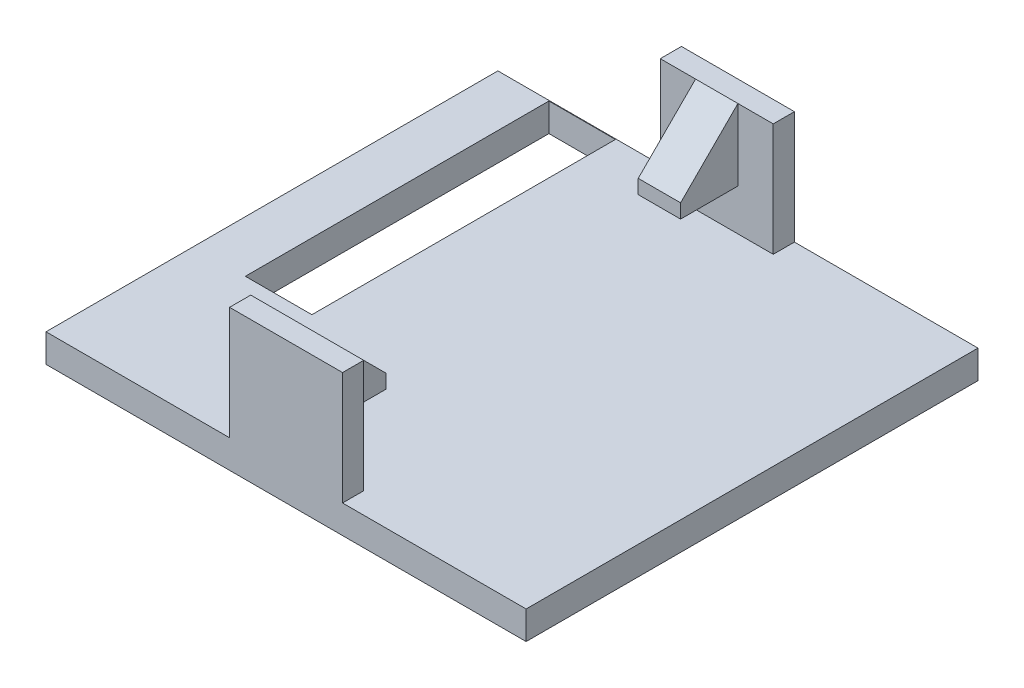
ISO-10303-21;
HEADER;
FILE_DESCRIPTION(('STEP AP214'),'2;1');
FILE_NAME('part.step','',(''),(''),'','','');
FILE_SCHEMA(('AUTOMOTIVE_DESIGN { 1 0 10303 214 1 1 1 1 }'));
ENDSEC;
DATA;
#1=APPLICATION_CONTEXT('core data for automotive mechanical design processes');
#2=APPLICATION_PROTOCOL_DEFINITION('international standard','automotive_design',2000,#1);
#3=PRODUCT_CONTEXT('',#1,'mechanical');
#4=PRODUCT('Part','Part','',(#3));
#5=PRODUCT_RELATED_PRODUCT_CATEGORY('part','',(#4));
#6=PRODUCT_DEFINITION_FORMATION('','',#4);
#7=PRODUCT_DEFINITION_CONTEXT('part definition',#1,'design');
#8=PRODUCT_DEFINITION('design','',#6,#7);
#9=PRODUCT_DEFINITION_SHAPE('','',#8);
#10=(LENGTH_UNIT() NAMED_UNIT(*) SI_UNIT(.MILLI.,.METRE.));
#11=(NAMED_UNIT(*) PLANE_ANGLE_UNIT() SI_UNIT($,.RADIAN.));
#12=(NAMED_UNIT(*) SI_UNIT($,.STERADIAN.) SOLID_ANGLE_UNIT());
#13=UNCERTAINTY_MEASURE_WITH_UNIT(LENGTH_MEASURE(1.E-05),#10,'distance_accuracy_value','');
#14=(GEOMETRIC_REPRESENTATION_CONTEXT(3) GLOBAL_UNCERTAINTY_ASSIGNED_CONTEXT((#13)) GLOBAL_UNIT_ASSIGNED_CONTEXT((#10,
#11,#12)) REPRESENTATION_CONTEXT('',''));
#15=CARTESIAN_POINT('',(0.,0.,0.));
#16=DIRECTION('',(0.,0.,1.));
#17=DIRECTION('',(1.,0.,0.));
#18=AXIS2_PLACEMENT_3D('',#15,#16,#17);
#19=CARTESIAN_POINT('',(0.,2.,0.));
#20=DIRECTION('',(0.,-1.,0.));
#21=DIRECTION('',(0.,0.,-1.));
#22=AXIS2_PLACEMENT_3D('',#19,#20,#21);
#23=PLANE('',#22);
#24=DIRECTION('',(1.,0.,0.));
#25=VECTOR('',#24,1.);
#26=CARTESIAN_POINT('',(-13.3450789031749,2.,5.5379262030686));
#27=LINE('',#26,#25);
#28=CARTESIAN_POINT('',(-13.3450789031749,2.,5.5379262030686));
#29=VERTEX_POINT('',#28);
#30=CARTESIAN_POINT('',(-8.63207002471189,2.,5.5379262030686));
#31=VERTEX_POINT('',#30);
#32=EDGE_CURVE('E216',#29,#31,#27,.T.);
#33=ORIENTED_EDGE('',*,*,#32,.F.);
#34=DIRECTION('',(0.,0.,1.));
#35=VECTOR('',#34,1.);
#36=CARTESIAN_POINT('',(-13.3450789031749,2.,-15.9601840970242));
#37=LINE('',#36,#35);
#38=CARTESIAN_POINT('',(-13.3450789031749,2.,-15.9601840970242));
#39=VERTEX_POINT('',#38);
#40=EDGE_CURVE('E62',#39,#29,#37,.T.);
#41=ORIENTED_EDGE('',*,*,#40,.F.);
#42=DIRECTION('',(-1.,0.,0.));
#43=VECTOR('',#42,1.);
#44=CARTESIAN_POINT('',(-13.3450789031749,2.,-15.9601840970242));
#45=LINE('',#44,#43);
#46=CARTESIAN_POINT('',(-8.63207002471189,2.,-15.9601840970242));
#47=VERTEX_POINT('',#46);
#48=EDGE_CURVE('E228',#47,#39,#45,.T.);
#49=ORIENTED_EDGE('',*,*,#48,.F.);
#50=DIRECTION('',(0.,0.,-1.));
#51=VECTOR('',#50,1.);
#52=CARTESIAN_POINT('',(-8.63207002471189,2.,-15.9601840970242));
#53=LINE('',#52,#51);
#54=EDGE_CURVE('E209',#31,#47,#53,.T.);
#55=ORIENTED_EDGE('',*,*,#54,.F.);
#56=EDGE_LOOP('',(#33,#41,#49,#55));
#57=FACE_BOUND('',#56,.T.);
#58=DIRECTION('',(-1.,0.,0.));
#59=VECTOR('',#58,1.);
#60=CARTESIAN_POINT('',(0.,2.,14.5));
#61=LINE('',#60,#59);
#62=CARTESIAN_POINT('',(4.,2.,14.5));
#63=VERTEX_POINT('',#62);
#64=CARTESIAN_POINT('',(-4.,2.,14.5));
#65=VERTEX_POINT('',#64);
#66=EDGE_CURVE('E329',#63,#65,#61,.T.);
#67=ORIENTED_EDGE('',*,*,#66,.F.);
#68=DIRECTION('',(0.,0.,1.));
#69=VECTOR('',#68,1.);
#70=CARTESIAN_POINT('',(4.,2.,14.5));
#71=LINE('',#70,#69);
#72=CARTESIAN_POINT('',(4.,2.,16.));
#73=VERTEX_POINT('',#72);
#74=EDGE_CURVE('E289',#63,#73,#71,.T.);
#75=ORIENTED_EDGE('',*,*,#74,.T.);
#76=DIRECTION('',(1.,0.,0.));
#77=VECTOR('',#76,1.);
#78=CARTESIAN_POINT('',(-17.,2.,16.));
#79=LINE('',#78,#77);
#80=CARTESIAN_POINT('',(17.,2.,16.));
#81=VERTEX_POINT('',#80);
#82=EDGE_CURVE('E403',#73,#81,#79,.T.);
#83=ORIENTED_EDGE('',*,*,#82,.T.);
#84=DIRECTION('',(0.,0.,-1.));
#85=VECTOR('',#84,1.);
#86=CARTESIAN_POINT('',(17.,2.,16.));
#87=LINE('',#86,#85);
#88=CARTESIAN_POINT('',(17.,2.,-16.));
#89=VERTEX_POINT('',#88);
#90=EDGE_CURVE('E394',#81,#89,#87,.T.);
#91=ORIENTED_EDGE('',*,*,#90,.T.);
#92=DIRECTION('',(-1.,0.,0.));
#93=VECTOR('',#92,1.);
#94=CARTESIAN_POINT('',(-17.,2.,-16.));
#95=LINE('',#94,#93);
#96=CARTESIAN_POINT('',(4.,2.,-16.));
#97=VERTEX_POINT('',#96);
#98=EDGE_CURVE('E396',#89,#97,#95,.T.);
#99=ORIENTED_EDGE('',*,*,#98,.T.);
#100=DIRECTION('',(0.,0.,-1.));
#101=VECTOR('',#100,1.);
#102=CARTESIAN_POINT('',(4.,2.,-14.5));
#103=LINE('',#102,#101);
#104=CARTESIAN_POINT('',(4.,2.,-14.5));
#105=VERTEX_POINT('',#104);
#106=EDGE_CURVE('E311',#105,#97,#103,.T.);
#107=ORIENTED_EDGE('',*,*,#106,.F.);
#108=DIRECTION('',(-1.,0.,0.));
#109=VECTOR('',#108,1.);
#110=CARTESIAN_POINT('',(0.,2.,-14.5));
#111=LINE('',#110,#109);
#112=CARTESIAN_POINT('',(-4.,2.,-14.5));
#113=VERTEX_POINT('',#112);
#114=EDGE_CURVE('E368',#105,#113,#111,.T.);
#115=ORIENTED_EDGE('',*,*,#114,.T.);
#116=DIRECTION('',(0.,0.,-1.));
#117=VECTOR('',#116,1.);
#118=CARTESIAN_POINT('',(-4.,2.,-14.5));
#119=LINE('',#118,#117);
#120=CARTESIAN_POINT('',(-4.,2.,-16.));
#121=VERTEX_POINT('',#120);
#122=EDGE_CURVE('E379',#113,#121,#119,.T.);
#123=ORIENTED_EDGE('',*,*,#122,.T.);
#124=CARTESIAN_POINT('',(-17.,2.,-16.));
#125=VERTEX_POINT('',#124);
#126=EDGE_CURVE('E400',#121,#125,#95,.T.);
#127=ORIENTED_EDGE('',*,*,#126,.T.);
#128=DIRECTION('',(0.,0.,1.));
#129=VECTOR('',#128,1.);
#130=CARTESIAN_POINT('',(-17.,2.,16.));
#131=LINE('',#130,#129);
#132=CARTESIAN_POINT('',(-17.,2.,16.));
#133=VERTEX_POINT('',#132);
#134=EDGE_CURVE('E405',#125,#133,#131,.T.);
#135=ORIENTED_EDGE('',*,*,#134,.T.);
#136=CARTESIAN_POINT('',(-4.,2.,16.));
#137=VERTEX_POINT('',#136);
#138=EDGE_CURVE('E407',#133,#137,#79,.T.);
#139=ORIENTED_EDGE('',*,*,#138,.T.);
#140=DIRECTION('',(0.,0.,1.));
#141=VECTOR('',#140,1.);
#142=CARTESIAN_POINT('',(-4.,2.,14.5));
#143=LINE('',#142,#141);
#144=EDGE_CURVE('E340',#65,#137,#143,.T.);
#145=ORIENTED_EDGE('',*,*,#144,.F.);
#146=EDGE_LOOP('',(#67,#75,#83,#91,#99,#107,#115,#123,#127,#135,#139,#145));
#147=FACE_BOUND('',#146,.T.);
#148=ADVANCED_FACE('F44',(#57,#147),#23,.F.);
#149=CARTESIAN_POINT('',(17.,2.,16.));
#150=DIRECTION('',(-1.,0.,0.));
#151=DIRECTION('',(0.,0.,1.));
#152=AXIS2_PLACEMENT_3D('',#149,#150,#151);
#153=PLANE('',#152);
#154=DIRECTION('',(0.,0.,-1.));
#155=VECTOR('',#154,1.);
#156=CARTESIAN_POINT('',(17.,0.,16.));
#157=LINE('',#156,#155);
#158=CARTESIAN_POINT('',(17.,0.,16.));
#159=VERTEX_POINT('',#158);
#160=CARTESIAN_POINT('',(17.,0.,-16.));
#161=VERTEX_POINT('',#160);
#162=EDGE_CURVE('E386',#159,#161,#157,.T.);
#163=ORIENTED_EDGE('',*,*,#162,.T.);
#164=DIRECTION('',(0.,-1.,0.));
#165=VECTOR('',#164,1.);
#166=CARTESIAN_POINT('',(17.,2.,-16.));
#167=LINE('',#166,#165);
#168=EDGE_CURVE('E433',#89,#161,#167,.T.);
#169=ORIENTED_EDGE('',*,*,#168,.F.);
#170=ORIENTED_EDGE('',*,*,#90,.F.);
#171=DIRECTION('',(0.,-1.,0.));
#172=VECTOR('',#171,1.);
#173=CARTESIAN_POINT('',(17.,2.,16.));
#174=LINE('',#173,#172);
#175=EDGE_CURVE('E408',#81,#159,#174,.T.);
#176=ORIENTED_EDGE('',*,*,#175,.T.);
#177=EDGE_LOOP('',(#163,#169,#170,#176));
#178=FACE_BOUND('',#177,.T.);
#179=ADVANCED_FACE('F50',(#178),#153,.F.);
#180=CARTESIAN_POINT('',(-17.,2.,-16.));
#181=DIRECTION('',(0.,0.,1.));
#182=DIRECTION('',(1.,0.,0.));
#183=AXIS2_PLACEMENT_3D('',#180,#181,#182);
#184=PLANE('',#183);
#185=DIRECTION('',(1.,0.,0.));
#186=VECTOR('',#185,1.);
#187=CARTESIAN_POINT('',(0.,10.,-16.));
#188=LINE('',#187,#186);
#189=CARTESIAN_POINT('',(-4.,10.,-16.));
#190=VERTEX_POINT('',#189);
#191=CARTESIAN_POINT('',(4.,10.,-16.));
#192=VERTEX_POINT('',#191);
#193=EDGE_CURVE('E375',#190,#192,#188,.T.);
#194=ORIENTED_EDGE('',*,*,#193,.T.);
#195=DIRECTION('',(0.,1.,0.));
#196=VECTOR('',#195,1.);
#197=CARTESIAN_POINT('',(4.,2.,-16.));
#198=LINE('',#197,#196);
#199=EDGE_CURVE('E298',#97,#192,#198,.T.);
#200=ORIENTED_EDGE('',*,*,#199,.F.);
#201=ORIENTED_EDGE('',*,*,#98,.F.);
#202=ORIENTED_EDGE('',*,*,#168,.T.);
#203=DIRECTION('',(-1.,0.,0.));
#204=VECTOR('',#203,1.);
#205=CARTESIAN_POINT('',(-17.,0.,-16.));
#206=LINE('',#205,#204);
#207=CARTESIAN_POINT('',(-17.,0.,-16.));
#208=VERTEX_POINT('',#207);
#209=EDGE_CURVE('E411',#161,#208,#206,.T.);
#210=ORIENTED_EDGE('',*,*,#209,.T.);
#211=DIRECTION('',(0.,-1.,0.));
#212=VECTOR('',#211,1.);
#213=CARTESIAN_POINT('',(-17.,2.,-16.));
#214=LINE('',#213,#212);
#215=EDGE_CURVE('E429',#125,#208,#214,.T.);
#216=ORIENTED_EDGE('',*,*,#215,.F.);
#217=ORIENTED_EDGE('',*,*,#126,.F.);
#218=DIRECTION('',(0.,1.,0.));
#219=VECTOR('',#218,1.);
#220=CARTESIAN_POINT('',(-4.,2.,-16.));
#221=LINE('',#220,#219);
#222=EDGE_CURVE('E360',#121,#190,#221,.T.);
#223=ORIENTED_EDGE('',*,*,#222,.T.);
#224=EDGE_LOOP('',(#194,#200,#201,#202,#210,#216,#217,#223));
#225=FACE_BOUND('',#224,.T.);
#226=ADVANCED_FACE('F483',(#225),#184,.F.);
#227=CARTESIAN_POINT('',(-17.,2.,16.));
#228=DIRECTION('',(1.,0.,0.));
#229=DIRECTION('',(0.,0.,-1.));
#230=AXIS2_PLACEMENT_3D('',#227,#228,#229);
#231=PLANE('',#230);
#232=DIRECTION('',(0.,0.,1.));
#233=VECTOR('',#232,1.);
#234=CARTESIAN_POINT('',(-17.,0.,16.));
#235=LINE('',#234,#233);
#236=CARTESIAN_POINT('',(-17.,0.,16.));
#237=VERTEX_POINT('',#236);
#238=EDGE_CURVE('E420',#208,#237,#235,.T.);
#239=ORIENTED_EDGE('',*,*,#238,.T.);
#240=DIRECTION('',(0.,-1.,0.));
#241=VECTOR('',#240,1.);
#242=CARTESIAN_POINT('',(-17.,2.,16.));
#243=LINE('',#242,#241);
#244=EDGE_CURVE('E424',#133,#237,#243,.T.);
#245=ORIENTED_EDGE('',*,*,#244,.F.);
#246=ORIENTED_EDGE('',*,*,#134,.F.);
#247=ORIENTED_EDGE('',*,*,#215,.T.);
#248=EDGE_LOOP('',(#239,#245,#246,#247));
#249=FACE_BOUND('',#248,.T.);
#250=ADVANCED_FACE('F496',(#249),#231,.F.);
#251=CARTESIAN_POINT('',(-17.,2.,16.));
#252=DIRECTION('',(0.,0.,-1.));
#253=DIRECTION('',(-1.,0.,0.));
#254=AXIS2_PLACEMENT_3D('',#251,#252,#253);
#255=PLANE('',#254);
#256=DIRECTION('',(0.,1.,0.));
#257=VECTOR('',#256,1.);
#258=CARTESIAN_POINT('',(4.,2.,16.));
#259=LINE('',#258,#257);
#260=CARTESIAN_POINT('',(4.,10.,16.));
#261=VERTEX_POINT('',#260);
#262=EDGE_CURVE('E279',#73,#261,#259,.T.);
#263=ORIENTED_EDGE('',*,*,#262,.T.);
#264=DIRECTION('',(1.,0.,0.));
#265=VECTOR('',#264,1.);
#266=CARTESIAN_POINT('',(0.,10.,16.));
#267=LINE('',#266,#265);
#268=CARTESIAN_POINT('',(-4.,10.,16.));
#269=VERTEX_POINT('',#268);
#270=EDGE_CURVE('E314',#269,#261,#267,.T.);
#271=ORIENTED_EDGE('',*,*,#270,.F.);
#272=DIRECTION('',(0.,1.,0.));
#273=VECTOR('',#272,1.);
#274=CARTESIAN_POINT('',(-4.,2.,16.));
#275=LINE('',#274,#273);
#276=EDGE_CURVE('E331',#137,#269,#275,.T.);
#277=ORIENTED_EDGE('',*,*,#276,.F.);
#278=ORIENTED_EDGE('',*,*,#138,.F.);
#279=ORIENTED_EDGE('',*,*,#244,.T.);
#280=DIRECTION('',(1.,0.,0.));
#281=VECTOR('',#280,1.);
#282=CARTESIAN_POINT('',(-17.,0.,16.));
#283=LINE('',#282,#281);
#284=EDGE_CURVE('E399',#237,#159,#283,.T.);
#285=ORIENTED_EDGE('',*,*,#284,.T.);
#286=ORIENTED_EDGE('',*,*,#175,.F.);
#287=ORIENTED_EDGE('',*,*,#82,.F.);
#288=EDGE_LOOP('',(#263,#271,#277,#278,#279,#285,#286,#287));
#289=FACE_BOUND('',#288,.T.);
#290=ADVANCED_FACE('F491',(#289),#255,.F.);
#291=CARTESIAN_POINT('',(0.,0.,0.));
#292=DIRECTION('',(0.,-1.,0.));
#293=DIRECTION('',(0.,0.,-1.));
#294=AXIS2_PLACEMENT_3D('',#291,#292,#293);
#295=PLANE('',#294);
#296=DIRECTION('',(0.,0.,-1.));
#297=VECTOR('',#296,1.);
#298=CARTESIAN_POINT('',(-13.3450789031749,0.,0.));
#299=LINE('',#298,#297);
#300=CARTESIAN_POINT('',(-13.3450789031749,0.,5.5379262030686));
#301=VERTEX_POINT('',#300);
#302=CARTESIAN_POINT('',(-13.3450789031749,0.,-15.9601840970242));
#303=VERTEX_POINT('',#302);
#304=EDGE_CURVE('E11',#301,#303,#299,.T.);
#305=ORIENTED_EDGE('',*,*,#304,.F.);
#306=DIRECTION('',(-1.,0.,0.));
#307=VECTOR('',#306,1.);
#308=CARTESIAN_POINT('',(0.,0.,5.5379262030686));
#309=LINE('',#308,#307);
#310=CARTESIAN_POINT('',(-8.63207002471189,0.,5.5379262030686));
#311=VERTEX_POINT('',#310);
#312=EDGE_CURVE('E455',#311,#301,#309,.T.);
#313=ORIENTED_EDGE('',*,*,#312,.F.);
#314=DIRECTION('',(0.,0.,1.));
#315=VECTOR('',#314,1.);
#316=CARTESIAN_POINT('',(-8.63207002471189,0.,0.));
#317=LINE('',#316,#315);
#318=CARTESIAN_POINT('',(-8.63207002471189,0.,-15.9601840970242));
#319=VERTEX_POINT('',#318);
#320=EDGE_CURVE('E215',#319,#311,#317,.T.);
#321=ORIENTED_EDGE('',*,*,#320,.F.);
#322=DIRECTION('',(1.,0.,0.));
#323=VECTOR('',#322,1.);
#324=CARTESIAN_POINT('',(0.,0.,-15.9601840970242));
#325=LINE('',#324,#323);
#326=EDGE_CURVE('E53',#303,#319,#325,.T.);
#327=ORIENTED_EDGE('',*,*,#326,.F.);
#328=EDGE_LOOP('',(#305,#313,#321,#327));
#329=FACE_BOUND('',#328,.T.);
#330=ORIENTED_EDGE('',*,*,#162,.F.);
#331=ORIENTED_EDGE('',*,*,#284,.F.);
#332=ORIENTED_EDGE('',*,*,#238,.F.);
#333=ORIENTED_EDGE('',*,*,#209,.F.);
#334=EDGE_LOOP('',(#330,#331,#332,#333));
#335=FACE_BOUND('',#334,.T.);
#336=ADVANCED_FACE('F464',(#329,#335),#295,.T.);
#337=CARTESIAN_POINT('',(0.,10.,-14.5));
#338=DIRECTION('',(0.,1.,0.));
#339=DIRECTION('',(0.,0.,1.));
#340=AXIS2_PLACEMENT_3D('',#337,#338,#339);
#341=PLANE('',#340);
#342=DIRECTION('',(1.,0.,0.));
#343=VECTOR('',#342,1.);
#344=CARTESIAN_POINT('',(-1.5,10.,-14.5));
#345=LINE('',#344,#343);
#346=CARTESIAN_POINT('',(-1.5,10.,-14.5));
#347=VERTEX_POINT('',#346);
#348=CARTESIAN_POINT('',(1.5,10.,-14.5));
#349=VERTEX_POINT('',#348);
#350=EDGE_CURVE('E353',#347,#349,#345,.T.);
#351=ORIENTED_EDGE('',*,*,#350,.T.);
#352=DIRECTION('',(-1.,0.,0.));
#353=VECTOR('',#352,1.);
#354=CARTESIAN_POINT('',(0.,10.,-14.5));
#355=LINE('',#354,#353);
#356=CARTESIAN_POINT('',(4.,10.,-14.5));
#357=VERTEX_POINT('',#356);
#358=EDGE_CURVE('E297',#357,#349,#355,.T.);
#359=ORIENTED_EDGE('',*,*,#358,.F.);
#360=DIRECTION('',(0.,0.,-1.));
#361=VECTOR('',#360,1.);
#362=CARTESIAN_POINT('',(4.,10.,-14.5));
#363=LINE('',#362,#361);
#364=EDGE_CURVE('E310',#357,#192,#363,.T.);
#365=ORIENTED_EDGE('',*,*,#364,.T.);
#366=ORIENTED_EDGE('',*,*,#193,.F.);
#367=DIRECTION('',(0.,0.,-1.));
#368=VECTOR('',#367,1.);
#369=CARTESIAN_POINT('',(-4.,10.,-14.5));
#370=LINE('',#369,#368);
#371=CARTESIAN_POINT('',(-4.,10.,-14.5));
#372=VERTEX_POINT('',#371);
#373=EDGE_CURVE('E387',#372,#190,#370,.T.);
#374=ORIENTED_EDGE('',*,*,#373,.F.);
#375=DIRECTION('',(1.,0.,0.));
#376=VECTOR('',#375,1.);
#377=CARTESIAN_POINT('',(0.,10.,-14.5));
#378=LINE('',#377,#376);
#379=EDGE_CURVE('E376',#372,#347,#378,.T.);
#380=ORIENTED_EDGE('',*,*,#379,.T.);
#381=EDGE_LOOP('',(#351,#359,#365,#366,#374,#380));
#382=FACE_BOUND('',#381,.T.);
#383=ADVANCED_FACE('F495',(#382),#341,.T.);
#384=CARTESIAN_POINT('',(-4.,2.,-14.5));
#385=DIRECTION('',(-1.,0.,0.));
#386=DIRECTION('',(0.,0.,1.));
#387=AXIS2_PLACEMENT_3D('',#384,#385,#386);
#388=PLANE('',#387);
#389=ORIENTED_EDGE('',*,*,#222,.F.);
#390=ORIENTED_EDGE('',*,*,#122,.F.);
#391=DIRECTION('',(0.,1.,0.));
#392=VECTOR('',#391,1.);
#393=CARTESIAN_POINT('',(-4.,2.,-14.5));
#394=LINE('',#393,#392);
#395=EDGE_CURVE('E371',#113,#372,#394,.T.);
#396=ORIENTED_EDGE('',*,*,#395,.T.);
#397=ORIENTED_EDGE('',*,*,#373,.T.);
#398=EDGE_LOOP('',(#389,#390,#396,#397));
#399=FACE_BOUND('',#398,.T.);
#400=ADVANCED_FACE('F490',(#399),#388,.T.);
#401=CARTESIAN_POINT('',(0.,0.,-14.5));
#402=DIRECTION('',(0.,0.,1.));
#403=DIRECTION('',(1.,0.,0.));
#404=AXIS2_PLACEMENT_3D('',#401,#402,#403);
#405=PLANE('',#404);
#406=ORIENTED_EDGE('',*,*,#395,.F.);
#407=ORIENTED_EDGE('',*,*,#114,.F.);
#408=DIRECTION('',(0.,1.,0.));
#409=VECTOR('',#408,1.);
#410=CARTESIAN_POINT('',(4.,2.,-14.5));
#411=LINE('',#410,#409);
#412=EDGE_CURVE('E302',#105,#357,#411,.T.);
#413=ORIENTED_EDGE('',*,*,#412,.T.);
#414=ORIENTED_EDGE('',*,*,#358,.T.);
#415=DIRECTION('',(0.,-1.,0.));
#416=VECTOR('',#415,1.);
#417=CARTESIAN_POINT('',(1.5,0.,-14.5));
#418=LINE('',#417,#416);
#419=CARTESIAN_POINT('',(1.5,4.93933982822015,-14.5));
#420=VERTEX_POINT('',#419);
#421=EDGE_CURVE('E443',#349,#420,#418,.T.);
#422=ORIENTED_EDGE('',*,*,#421,.T.);
#423=DIRECTION('',(1.,0.,0.));
#424=VECTOR('',#423,1.);
#425=CARTESIAN_POINT('',(-1.5,4.93933982822015,-14.5));
#426=LINE('',#425,#424);
#427=CARTESIAN_POINT('',(-1.5,4.93933982822015,-14.5));
#428=VERTEX_POINT('',#427);
#429=EDGE_CURVE('E358',#428,#420,#426,.T.);
#430=ORIENTED_EDGE('',*,*,#429,.F.);
#431=DIRECTION('',(0.,1.,0.));
#432=VECTOR('',#431,1.);
#433=CARTESIAN_POINT('',(-1.5,0.,-14.5));
#434=LINE('',#433,#432);
#435=EDGE_CURVE('E440',#428,#347,#434,.T.);
#436=ORIENTED_EDGE('',*,*,#435,.T.);
#437=ORIENTED_EDGE('',*,*,#379,.F.);
#438=EDGE_LOOP('',(#406,#407,#413,#414,#422,#430,#436,#437));
#439=FACE_BOUND('',#438,.T.);
#440=ADVANCED_FACE('F519',(#439),#405,.T.);
#441=CARTESIAN_POINT('',(-1.5,4.93933982822015,-10.4393398282202));
#442=DIRECTION('',(0.,-1.,0.));
#443=DIRECTION('',(0.,0.,-1.));
#444=AXIS2_PLACEMENT_3D('',#441,#442,#443);
#445=PLANE('',#444);
#446=ORIENTED_EDGE('',*,*,#429,.T.);
#447=DIRECTION('',(0.,0.,-1.));
#448=VECTOR('',#447,1.);
#449=CARTESIAN_POINT('',(1.5,4.93933982822015,-10.4393398282202));
#450=LINE('',#449,#448);
#451=CARTESIAN_POINT('',(1.5,4.93933982822015,-10.4393398282202));
#452=VERTEX_POINT('',#451);
#453=EDGE_CURVE('E255',#452,#420,#450,.T.);
#454=ORIENTED_EDGE('',*,*,#453,.F.);
#455=DIRECTION('',(1.,0.,0.));
#456=VECTOR('',#455,1.);
#457=CARTESIAN_POINT('',(-1.5,4.93933982822015,-10.4393398282202));
#458=LINE('',#457,#456);
#459=CARTESIAN_POINT('',(-1.5,4.93933982822015,-10.4393398282202));
#460=VERTEX_POINT('',#459);
#461=EDGE_CURVE('E359',#460,#452,#458,.T.);
#462=ORIENTED_EDGE('',*,*,#461,.F.);
#463=DIRECTION('',(0.,0.,-1.));
#464=VECTOR('',#463,1.);
#465=CARTESIAN_POINT('',(-1.5,4.93933982822015,-10.4393398282202));
#466=LINE('',#465,#464);
#467=EDGE_CURVE('E352',#460,#428,#466,.T.);
#468=ORIENTED_EDGE('',*,*,#467,.T.);
#469=EDGE_LOOP('',(#446,#454,#462,#468));
#470=FACE_BOUND('',#469,.T.);
#471=ADVANCED_FACE('F596',(#470),#445,.T.);
#472=CARTESIAN_POINT('',(-1.5,5.93933982822015,-10.4393398282202));
#473=DIRECTION('',(0.,0.,1.));
#474=DIRECTION('',(1.,0.,0.));
#475=AXIS2_PLACEMENT_3D('',#472,#473,#474);
#476=PLANE('',#475);
#477=ORIENTED_EDGE('',*,*,#461,.T.);
#478=DIRECTION('',(0.,-1.,0.));
#479=VECTOR('',#478,1.);
#480=CARTESIAN_POINT('',(1.5,5.93933982822015,-10.4393398282202));
#481=LINE('',#480,#479);
#482=CARTESIAN_POINT('',(1.5,5.93933982822015,-10.4393398282202));
#483=VERTEX_POINT('',#482);
#484=EDGE_CURVE('E257',#483,#452,#481,.T.);
#485=ORIENTED_EDGE('',*,*,#484,.F.);
#486=DIRECTION('',(1.,0.,0.));
#487=VECTOR('',#486,1.);
#488=CARTESIAN_POINT('',(-1.5,5.93933982822015,-10.4393398282202));
#489=LINE('',#488,#487);
#490=CARTESIAN_POINT('',(-1.5,5.93933982822015,-10.4393398282202));
#491=VERTEX_POINT('',#490);
#492=EDGE_CURVE('E361',#491,#483,#489,.T.);
#493=ORIENTED_EDGE('',*,*,#492,.F.);
#494=DIRECTION('',(0.,-1.,0.));
#495=VECTOR('',#494,1.);
#496=CARTESIAN_POINT('',(-1.5,5.93933982822015,-10.4393398282202));
#497=LINE('',#496,#495);
#498=EDGE_CURVE('E350',#491,#460,#497,.T.);
#499=ORIENTED_EDGE('',*,*,#498,.T.);
#500=EDGE_LOOP('',(#477,#485,#493,#499));
#501=FACE_BOUND('',#500,.T.);
#502=ADVANCED_FACE('F602',(#501),#476,.T.);
#503=CARTESIAN_POINT('',(-1.5,10.,-14.5));
#504=DIRECTION('',(0.,0.707106781186542,0.707106781186553));
#505=DIRECTION('',(0.,-0.707106781186553,0.707106781186542));
#506=AXIS2_PLACEMENT_3D('',#503,#504,#505);
#507=PLANE('',#506);
#508=ORIENTED_EDGE('',*,*,#492,.T.);
#509=DIRECTION('',(0.,-0.707106781186553,0.707106781186542));
#510=VECTOR('',#509,1.);
#511=CARTESIAN_POINT('',(1.5,10.,-14.5));
#512=LINE('',#511,#510);
#513=EDGE_CURVE('E258',#349,#483,#512,.T.);
#514=ORIENTED_EDGE('',*,*,#513,.F.);
#515=ORIENTED_EDGE('',*,*,#350,.F.);
#516=DIRECTION('',(0.,-0.707106781186553,0.707106781186542));
#517=VECTOR('',#516,1.);
#518=CARTESIAN_POINT('',(-1.5,10.,-14.5));
#519=LINE('',#518,#517);
#520=EDGE_CURVE('E338',#347,#491,#519,.T.);
#521=ORIENTED_EDGE('',*,*,#520,.T.);
#522=EDGE_LOOP('',(#508,#514,#515,#521));
#523=FACE_BOUND('',#522,.T.);
#524=ADVANCED_FACE('F597',(#523),#507,.T.);
#525=CARTESIAN_POINT('',(-1.5,0.,0.));
#526=DIRECTION('',(1.,0.,0.));
#527=DIRECTION('',(0.,0.,-1.));
#528=AXIS2_PLACEMENT_3D('',#525,#526,#527);
#529=PLANE('',#528);
#530=ORIENTED_EDGE('',*,*,#435,.F.);
#531=ORIENTED_EDGE('',*,*,#467,.F.);
#532=ORIENTED_EDGE('',*,*,#498,.F.);
#533=ORIENTED_EDGE('',*,*,#520,.F.);
#534=EDGE_LOOP('',(#530,#531,#532,#533));
#535=FACE_BOUND('',#534,.T.);
#536=ADVANCED_FACE('F595',(#535),#529,.F.);
#537=CARTESIAN_POINT('',(-4.,2.,14.5));
#538=DIRECTION('',(1.,0.,0.));
#539=DIRECTION('',(0.,0.,-1.));
#540=AXIS2_PLACEMENT_3D('',#537,#538,#539);
#541=PLANE('',#540);
#542=ORIENTED_EDGE('',*,*,#276,.T.);
#543=DIRECTION('',(0.,0.,1.));
#544=VECTOR('',#543,1.);
#545=CARTESIAN_POINT('',(-4.,10.,14.5));
#546=LINE('',#545,#544);
#547=CARTESIAN_POINT('',(-4.,10.,14.5));
#548=VERTEX_POINT('',#547);
#549=EDGE_CURVE('E332',#548,#269,#546,.T.);
#550=ORIENTED_EDGE('',*,*,#549,.F.);
#551=DIRECTION('',(0.,1.,0.));
#552=VECTOR('',#551,1.);
#553=CARTESIAN_POINT('',(-4.,2.,14.5));
#554=LINE('',#553,#552);
#555=EDGE_CURVE('E324',#65,#548,#554,.T.);
#556=ORIENTED_EDGE('',*,*,#555,.F.);
#557=ORIENTED_EDGE('',*,*,#144,.T.);
#558=EDGE_LOOP('',(#542,#550,#556,#557));
#559=FACE_BOUND('',#558,.T.);
#560=ADVANCED_FACE('F554',(#559),#541,.F.);
#561=CARTESIAN_POINT('',(0.,10.,14.5));
#562=DIRECTION('',(0.,-1.,0.));
#563=DIRECTION('',(0.,0.,-1.));
#564=AXIS2_PLACEMENT_3D('',#561,#562,#563);
#565=PLANE('',#564);
#566=ORIENTED_EDGE('',*,*,#270,.T.);
#567=DIRECTION('',(0.,0.,1.));
#568=VECTOR('',#567,1.);
#569=CARTESIAN_POINT('',(4.,10.,14.5));
#570=LINE('',#569,#568);
#571=CARTESIAN_POINT('',(4.,10.,14.5));
#572=VERTEX_POINT('',#571);
#573=EDGE_CURVE('E292',#572,#261,#570,.T.);
#574=ORIENTED_EDGE('',*,*,#573,.F.);
#575=DIRECTION('',(1.,0.,0.));
#576=VECTOR('',#575,1.);
#577=CARTESIAN_POINT('',(0.,10.,14.5));
#578=LINE('',#577,#576);
#579=CARTESIAN_POINT('',(1.5,10.,14.5));
#580=VERTEX_POINT('',#579);
#581=EDGE_CURVE('E323',#580,#572,#578,.T.);
#582=ORIENTED_EDGE('',*,*,#581,.F.);
#583=CARTESIAN_POINT('',(-1.5,10.,14.5));
#584=VERTEX_POINT('',#583);
#585=EDGE_CURVE('E321',#584,#580,#578,.T.);
#586=ORIENTED_EDGE('',*,*,#585,.F.);
#587=EDGE_CURVE('E316',#548,#584,#578,.T.);
#588=ORIENTED_EDGE('',*,*,#587,.F.);
#589=ORIENTED_EDGE('',*,*,#549,.T.);
#590=EDGE_LOOP('',(#566,#574,#582,#586,#588,#589));
#591=FACE_BOUND('',#590,.T.);
#592=ADVANCED_FACE('F547',(#591),#565,.F.);
#593=CARTESIAN_POINT('',(0.,0.,14.5));
#594=DIRECTION('',(0.,0.,-1.));
#595=DIRECTION('',(1.,0.,0.));
#596=AXIS2_PLACEMENT_3D('',#593,#594,#595);
#597=PLANE('',#596);
#598=DIRECTION('',(1.,0.,0.));
#599=VECTOR('',#598,1.);
#600=CARTESIAN_POINT('',(-1.5,4.93933982822015,14.5));
#601=LINE('',#600,#599);
#602=CARTESIAN_POINT('',(-1.5,4.93933982822015,14.5));
#603=VERTEX_POINT('',#602);
#604=CARTESIAN_POINT('',(1.5,4.93933982822015,14.5));
#605=VERTEX_POINT('',#604);
#606=EDGE_CURVE('E274',#603,#605,#601,.T.);
#607=ORIENTED_EDGE('',*,*,#606,.T.);
#608=DIRECTION('',(0.,1.,0.));
#609=VECTOR('',#608,1.);
#610=CARTESIAN_POINT('',(1.5,0.,14.5));
#611=LINE('',#610,#609);
#612=EDGE_CURVE('E449',#605,#580,#611,.T.);
#613=ORIENTED_EDGE('',*,*,#612,.T.);
#614=ORIENTED_EDGE('',*,*,#581,.T.);
#615=DIRECTION('',(0.,1.,0.));
#616=VECTOR('',#615,1.);
#617=CARTESIAN_POINT('',(4.,2.,14.5));
#618=LINE('',#617,#616);
#619=EDGE_CURVE('E281',#63,#572,#618,.T.);
#620=ORIENTED_EDGE('',*,*,#619,.F.);
#621=ORIENTED_EDGE('',*,*,#66,.T.);
#622=ORIENTED_EDGE('',*,*,#555,.T.);
#623=ORIENTED_EDGE('',*,*,#587,.T.);
#624=DIRECTION('',(0.,-1.,0.));
#625=VECTOR('',#624,1.);
#626=CARTESIAN_POINT('',(-1.5,0.,14.5));
#627=LINE('',#626,#625);
#628=EDGE_CURVE('E441',#584,#603,#627,.T.);
#629=ORIENTED_EDGE('',*,*,#628,.T.);
#630=EDGE_LOOP('',(#607,#613,#614,#620,#621,#622,#623,#629));
#631=FACE_BOUND('',#630,.T.);
#632=ADVANCED_FACE('F544',(#631),#597,.T.);
#633=CARTESIAN_POINT('',(4.,2.,-14.5));
#634=DIRECTION('',(-1.,0.,0.));
#635=DIRECTION('',(0.,0.,1.));
#636=AXIS2_PLACEMENT_3D('',#633,#634,#635);
#637=PLANE('',#636);
#638=ORIENTED_EDGE('',*,*,#199,.T.);
#639=ORIENTED_EDGE('',*,*,#364,.F.);
#640=ORIENTED_EDGE('',*,*,#412,.F.);
#641=ORIENTED_EDGE('',*,*,#106,.T.);
#642=EDGE_LOOP('',(#638,#639,#640,#641));
#643=FACE_BOUND('',#642,.T.);
#644=ADVANCED_FACE('F512',(#643),#637,.F.);
#645=CARTESIAN_POINT('',(4.,2.,14.5));
#646=DIRECTION('',(1.,0.,0.));
#647=DIRECTION('',(0.,0.,-1.));
#648=AXIS2_PLACEMENT_3D('',#645,#646,#647);
#649=PLANE('',#648);
#650=ORIENTED_EDGE('',*,*,#262,.F.);
#651=ORIENTED_EDGE('',*,*,#74,.F.);
#652=ORIENTED_EDGE('',*,*,#619,.T.);
#653=ORIENTED_EDGE('',*,*,#573,.T.);
#654=EDGE_LOOP('',(#650,#651,#652,#653));
#655=FACE_BOUND('',#654,.T.);
#656=ADVANCED_FACE('F546',(#655),#649,.T.);
#657=CARTESIAN_POINT('',(-1.5,10.,14.5));
#658=DIRECTION('',(0.,-0.707106781186542,0.707106781186553));
#659=DIRECTION('',(0.,-0.707106781186553,-0.707106781186542));
#660=AXIS2_PLACEMENT_3D('',#657,#658,#659);
#661=PLANE('',#660);
#662=DIRECTION('',(0.,-0.707106781186553,-0.707106781186542));
#663=VECTOR('',#662,1.);
#664=CARTESIAN_POINT('',(-1.5,10.,14.5));
#665=LINE('',#664,#663);
#666=CARTESIAN_POINT('',(-1.5,5.93933982822015,10.4393398282202));
#667=VERTEX_POINT('',#666);
#668=EDGE_CURVE('E272',#584,#667,#665,.T.);
#669=ORIENTED_EDGE('',*,*,#668,.F.);
#670=ORIENTED_EDGE('',*,*,#585,.T.);
#671=DIRECTION('',(0.,-0.707106781186553,-0.707106781186542));
#672=VECTOR('',#671,1.);
#673=CARTESIAN_POINT('',(1.5,10.,14.5));
#674=LINE('',#673,#672);
#675=CARTESIAN_POINT('',(1.5,5.93933982822015,10.4393398282202));
#676=VERTEX_POINT('',#675);
#677=EDGE_CURVE('E236',#580,#676,#674,.T.);
#678=ORIENTED_EDGE('',*,*,#677,.T.);
#679=DIRECTION('',(1.,0.,0.));
#680=VECTOR('',#679,1.);
#681=CARTESIAN_POINT('',(-1.5,5.93933982822015,10.4393398282202));
#682=LINE('',#681,#680);
#683=EDGE_CURVE('E273',#667,#676,#682,.T.);
#684=ORIENTED_EDGE('',*,*,#683,.F.);
#685=EDGE_LOOP('',(#669,#670,#678,#684));
#686=FACE_BOUND('',#685,.T.);
#687=ADVANCED_FACE('F564',(#686),#661,.F.);
#688=CARTESIAN_POINT('',(-1.5,5.93933982822015,10.4393398282202));
#689=DIRECTION('',(0.,0.,1.));
#690=DIRECTION('',(1.,0.,0.));
#691=AXIS2_PLACEMENT_3D('',#688,#689,#690);
#692=PLANE('',#691);
#693=ORIENTED_EDGE('',*,*,#683,.T.);
#694=DIRECTION('',(0.,-1.,0.));
#695=VECTOR('',#694,1.);
#696=CARTESIAN_POINT('',(1.5,5.93933982822015,10.4393398282202));
#697=LINE('',#696,#695);
#698=CARTESIAN_POINT('',(1.5,4.93933982822015,10.4393398282202));
#699=VERTEX_POINT('',#698);
#700=EDGE_CURVE('E242',#676,#699,#697,.T.);
#701=ORIENTED_EDGE('',*,*,#700,.T.);
#702=DIRECTION('',(1.,0.,0.));
#703=VECTOR('',#702,1.);
#704=CARTESIAN_POINT('',(-1.5,4.93933982822015,10.4393398282202));
#705=LINE('',#704,#703);
#706=CARTESIAN_POINT('',(-1.5,4.93933982822015,10.4393398282202));
#707=VERTEX_POINT('',#706);
#708=EDGE_CURVE('E276',#707,#699,#705,.T.);
#709=ORIENTED_EDGE('',*,*,#708,.F.);
#710=DIRECTION('',(0.,-1.,0.));
#711=VECTOR('',#710,1.);
#712=CARTESIAN_POINT('',(-1.5,5.93933982822015,10.4393398282202));
#713=LINE('',#712,#711);
#714=EDGE_CURVE('E269',#667,#707,#713,.T.);
#715=ORIENTED_EDGE('',*,*,#714,.F.);
#716=EDGE_LOOP('',(#693,#701,#709,#715));
#717=FACE_BOUND('',#716,.T.);
#718=ADVANCED_FACE('F569',(#717),#692,.F.);
#719=CARTESIAN_POINT('',(-1.5,4.93933982822015,10.4393398282202));
#720=DIRECTION('',(0.,1.,0.));
#721=DIRECTION('',(0.,0.,1.));
#722=AXIS2_PLACEMENT_3D('',#719,#720,#721);
#723=PLANE('',#722);
#724=ORIENTED_EDGE('',*,*,#708,.T.);
#725=DIRECTION('',(0.,0.,1.));
#726=VECTOR('',#725,1.);
#727=CARTESIAN_POINT('',(1.5,4.93933982822015,10.4393398282202));
#728=LINE('',#727,#726);
#729=EDGE_CURVE('E247',#699,#605,#728,.T.);
#730=ORIENTED_EDGE('',*,*,#729,.T.);
#731=ORIENTED_EDGE('',*,*,#606,.F.);
#732=DIRECTION('',(0.,0.,1.));
#733=VECTOR('',#732,1.);
#734=CARTESIAN_POINT('',(-1.5,4.93933982822015,10.4393398282202));
#735=LINE('',#734,#733);
#736=EDGE_CURVE('E261',#707,#603,#735,.T.);
#737=ORIENTED_EDGE('',*,*,#736,.F.);
#738=EDGE_LOOP('',(#724,#730,#731,#737));
#739=FACE_BOUND('',#738,.T.);
#740=ADVANCED_FACE('F572',(#739),#723,.F.);
#741=CARTESIAN_POINT('',(-1.5,0.,0.));
#742=DIRECTION('',(1.,0.,0.));
#743=DIRECTION('',(0.,0.,1.));
#744=AXIS2_PLACEMENT_3D('',#741,#742,#743);
#745=PLANE('',#744);
#746=ORIENTED_EDGE('',*,*,#628,.F.);
#747=ORIENTED_EDGE('',*,*,#668,.T.);
#748=ORIENTED_EDGE('',*,*,#714,.T.);
#749=ORIENTED_EDGE('',*,*,#736,.T.);
#750=EDGE_LOOP('',(#746,#747,#748,#749));
#751=FACE_BOUND('',#750,.T.);
#752=ADVANCED_FACE('F557',(#751),#745,.F.);
#753=CARTESIAN_POINT('',(1.5,0.,0.));
#754=DIRECTION('',(-1.,0.,0.));
#755=DIRECTION('',(0.,0.,-1.));
#756=AXIS2_PLACEMENT_3D('',#753,#754,#755);
#757=PLANE('',#756);
#758=ORIENTED_EDGE('',*,*,#421,.F.);
#759=ORIENTED_EDGE('',*,*,#513,.T.);
#760=ORIENTED_EDGE('',*,*,#484,.T.);
#761=ORIENTED_EDGE('',*,*,#453,.T.);
#762=EDGE_LOOP('',(#758,#759,#760,#761));
#763=FACE_BOUND('',#762,.T.);
#764=ADVANCED_FACE('F477',(#763),#757,.F.);
#765=CARTESIAN_POINT('',(1.5,0.,0.));
#766=DIRECTION('',(-1.,0.,0.));
#767=DIRECTION('',(0.,0.,1.));
#768=AXIS2_PLACEMENT_3D('',#765,#766,#767);
#769=PLANE('',#768);
#770=ORIENTED_EDGE('',*,*,#612,.F.);
#771=ORIENTED_EDGE('',*,*,#729,.F.);
#772=ORIENTED_EDGE('',*,*,#700,.F.);
#773=ORIENTED_EDGE('',*,*,#677,.F.);
#774=EDGE_LOOP('',(#770,#771,#772,#773));
#775=FACE_BOUND('',#774,.T.);
#776=ADVANCED_FACE('F466',(#775),#769,.F.);
#777=CARTESIAN_POINT('',(-13.3450789031749,-5.5,-15.9601840970242));
#778=DIRECTION('',(-1.,0.,0.));
#779=DIRECTION('',(0.,0.,1.));
#780=AXIS2_PLACEMENT_3D('',#777,#778,#779);
#781=PLANE('',#780);
#782=ORIENTED_EDGE('',*,*,#304,.T.);
#783=DIRECTION('',(0.,1.,0.));
#784=VECTOR('',#783,1.);
#785=CARTESIAN_POINT('',(-13.3450789031749,-5.5,-15.9601840970242));
#786=LINE('',#785,#784);
#787=EDGE_CURVE('E231',#303,#39,#786,.T.);
#788=ORIENTED_EDGE('',*,*,#787,.T.);
#789=ORIENTED_EDGE('',*,*,#40,.T.);
#790=DIRECTION('',(0.,1.,0.));
#791=VECTOR('',#790,1.);
#792=CARTESIAN_POINT('',(-13.3450789031749,-5.5,5.5379262030686));
#793=LINE('',#792,#791);
#794=EDGE_CURVE('E217',#301,#29,#793,.T.);
#795=ORIENTED_EDGE('',*,*,#794,.F.);
#796=EDGE_LOOP('',(#782,#788,#789,#795));
#797=FACE_BOUND('',#796,.T.);
#798=ADVANCED_FACE('F463',(#797),#781,.F.);
#799=CARTESIAN_POINT('',(-13.3450789031749,-5.5,-15.9601840970242));
#800=DIRECTION('',(0.,0.,-1.));
#801=DIRECTION('',(-1.,0.,0.));
#802=AXIS2_PLACEMENT_3D('',#799,#800,#801);
#803=PLANE('',#802);
#804=ORIENTED_EDGE('',*,*,#326,.T.);
#805=DIRECTION('',(0.,1.,0.));
#806=VECTOR('',#805,1.);
#807=CARTESIAN_POINT('',(-8.63207002471189,-5.5,-15.9601840970242));
#808=LINE('',#807,#806);
#809=EDGE_CURVE('E213',#319,#47,#808,.T.);
#810=ORIENTED_EDGE('',*,*,#809,.T.);
#811=ORIENTED_EDGE('',*,*,#48,.T.);
#812=ORIENTED_EDGE('',*,*,#787,.F.);
#813=EDGE_LOOP('',(#804,#810,#811,#812));
#814=FACE_BOUND('',#813,.T.);
#815=ADVANCED_FACE('F458',(#814),#803,.F.);
#816=CARTESIAN_POINT('',(-8.63207002471189,-5.5,-15.9601840970242));
#817=DIRECTION('',(1.,0.,0.));
#818=DIRECTION('',(0.,0.,-1.));
#819=AXIS2_PLACEMENT_3D('',#816,#817,#818);
#820=PLANE('',#819);
#821=ORIENTED_EDGE('',*,*,#320,.T.);
#822=DIRECTION('',(0.,1.,0.));
#823=VECTOR('',#822,1.);
#824=CARTESIAN_POINT('',(-8.63207002471189,-5.5,5.5379262030686));
#825=LINE('',#824,#823);
#826=EDGE_CURVE('E66',#311,#31,#825,.T.);
#827=ORIENTED_EDGE('',*,*,#826,.T.);
#828=ORIENTED_EDGE('',*,*,#54,.T.);
#829=ORIENTED_EDGE('',*,*,#809,.F.);
#830=EDGE_LOOP('',(#821,#827,#828,#829));
#831=FACE_BOUND('',#830,.T.);
#832=ADVANCED_FACE('F207',(#831),#820,.F.);
#833=CARTESIAN_POINT('',(-13.3450789031749,-5.5,5.5379262030686));
#834=DIRECTION('',(0.,0.,1.));
#835=DIRECTION('',(1.,0.,0.));
#836=AXIS2_PLACEMENT_3D('',#833,#834,#835);
#837=PLANE('',#836);
#838=ORIENTED_EDGE('',*,*,#312,.T.);
#839=ORIENTED_EDGE('',*,*,#794,.T.);
#840=ORIENTED_EDGE('',*,*,#32,.T.);
#841=ORIENTED_EDGE('',*,*,#826,.F.);
#842=EDGE_LOOP('',(#838,#839,#840,#841));
#843=FACE_BOUND('',#842,.T.);
#844=ADVANCED_FACE('F218',(#843),#837,.F.);
#845=CLOSED_SHELL('',(#148,#179,#226,#250,#290,#336,#383,#400,#440,#471,#502,#524,#536,#560,
#592,#632,#644,#656,#687,#718,#740,#752,#764,#776,#798,#815,#832,#844));
#846=MANIFOLD_SOLID_BREP('B2',#845);
#847=ADVANCED_BREP_SHAPE_REPRESENTATION('',(#18,#846),#14);
#848=SHAPE_DEFINITION_REPRESENTATION(#9,#847);
ENDSEC;
END-ISO-10303-21;
